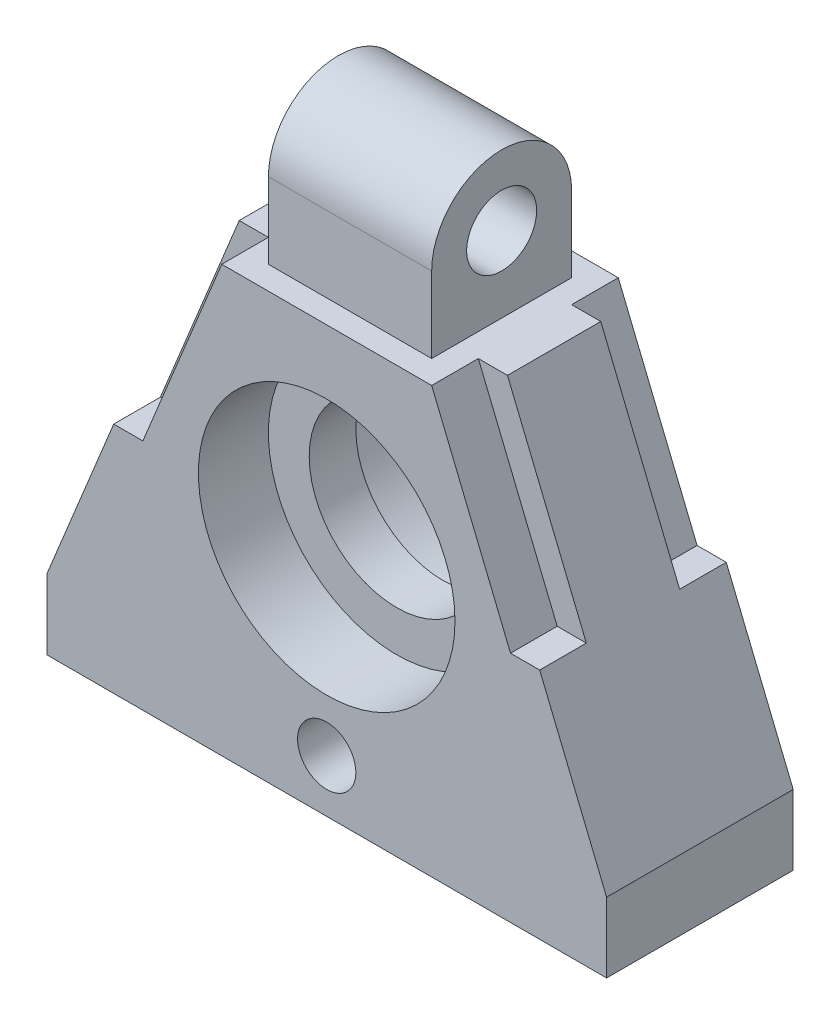
ISO-10303-21;
HEADER;
FILE_DESCRIPTION(('STEP AP214'),'2;1');
FILE_NAME('part.step','',(''),(''),'','','');
FILE_SCHEMA(('AUTOMOTIVE_DESIGN { 1 0 10303 214 1 1 1 1 }'));
ENDSEC;
DATA;
#1=APPLICATION_CONTEXT('core data for automotive mechanical design processes');
#2=APPLICATION_PROTOCOL_DEFINITION('international standard','automotive_design',2000,#1);
#3=PRODUCT_CONTEXT('',#1,'mechanical');
#4=PRODUCT('Part','Part','',(#3));
#5=PRODUCT_RELATED_PRODUCT_CATEGORY('part','',(#4));
#6=PRODUCT_DEFINITION_FORMATION('','',#4);
#7=PRODUCT_DEFINITION_CONTEXT('part definition',#1,'design');
#8=PRODUCT_DEFINITION('design','',#6,#7);
#9=PRODUCT_DEFINITION_SHAPE('','',#8);
#10=(LENGTH_UNIT() NAMED_UNIT(*) SI_UNIT(.MILLI.,.METRE.));
#11=(NAMED_UNIT(*) PLANE_ANGLE_UNIT() SI_UNIT($,.RADIAN.));
#12=(NAMED_UNIT(*) SI_UNIT($,.STERADIAN.) SOLID_ANGLE_UNIT());
#13=UNCERTAINTY_MEASURE_WITH_UNIT(LENGTH_MEASURE(1.E-05),#10,'distance_accuracy_value','');
#14=(GEOMETRIC_REPRESENTATION_CONTEXT(3) GLOBAL_UNCERTAINTY_ASSIGNED_CONTEXT((#13)) GLOBAL_UNIT_ASSIGNED_CONTEXT((#10,
#11,#12)) REPRESENTATION_CONTEXT('',''));
#15=CARTESIAN_POINT('',(0.,0.,0.));
#16=DIRECTION('',(0.,0.,1.));
#17=DIRECTION('',(1.,0.,0.));
#18=AXIS2_PLACEMENT_3D('',#15,#16,#17);
#19=CARTESIAN_POINT('',(-23.,73.,16.));
#20=DIRECTION('',(0.,-1.,0.));
#21=DIRECTION('',(0.,0.,-1.));
#22=AXIS2_PLACEMENT_3D('',#19,#20,#21);
#23=PLANE('',#22);
#24=DIRECTION('',(0.,0.,-1.));
#25=VECTOR('',#24,1.);
#26=CARTESIAN_POINT('',(-18.,73.,-8.));
#27=LINE('',#26,#25);
#28=CARTESIAN_POINT('',(-18.,73.,-8.));
#29=VERTEX_POINT('',#28);
#30=CARTESIAN_POINT('',(-18.,73.,-16.));
#31=VERTEX_POINT('',#30);
#32=EDGE_CURVE('E237',#29,#31,#27,.T.);
#33=ORIENTED_EDGE('',*,*,#32,.F.);
#34=DIRECTION('',(-1.,0.,0.));
#35=VECTOR('',#34,1.);
#36=CARTESIAN_POINT('',(-18.,73.,-8.));
#37=LINE('',#36,#35);
#38=CARTESIAN_POINT('',(-23.,73.,-8.));
#39=VERTEX_POINT('',#38);
#40=EDGE_CURVE('E229',#29,#39,#37,.T.);
#41=ORIENTED_EDGE('',*,*,#40,.T.);
#42=DIRECTION('',(0.,0.,-1.));
#43=VECTOR('',#42,1.);
#44=CARTESIAN_POINT('',(-23.,73.,16.));
#45=LINE('',#44,#43);
#46=CARTESIAN_POINT('',(-23.,73.,8.));
#47=VERTEX_POINT('',#46);
#48=EDGE_CURVE('E350',#47,#39,#45,.T.);
#49=ORIENTED_EDGE('',*,*,#48,.F.);
#50=DIRECTION('',(-1.,0.,0.));
#51=VECTOR('',#50,1.);
#52=CARTESIAN_POINT('',(-18.,73.,8.));
#53=LINE('',#52,#51);
#54=CARTESIAN_POINT('',(-18.,73.,8.));
#55=VERTEX_POINT('',#54);
#56=EDGE_CURVE('E278',#55,#47,#53,.T.);
#57=ORIENTED_EDGE('',*,*,#56,.F.);
#58=DIRECTION('',(0.,0.,1.));
#59=VECTOR('',#58,1.);
#60=CARTESIAN_POINT('',(-18.,73.,8.));
#61=LINE('',#60,#59);
#62=CARTESIAN_POINT('',(-18.,73.,16.));
#63=VERTEX_POINT('',#62);
#64=EDGE_CURVE('E286',#55,#63,#61,.T.);
#65=ORIENTED_EDGE('',*,*,#64,.T.);
#66=DIRECTION('',(-1.,0.,0.));
#67=VECTOR('',#66,1.);
#68=CARTESIAN_POINT('',(-23.,73.,16.));
#69=LINE('',#68,#67);
#70=CARTESIAN_POINT('',(18.,73.,16.));
#71=VERTEX_POINT('',#70);
#72=EDGE_CURVE('E347',#71,#63,#69,.T.);
#73=ORIENTED_EDGE('',*,*,#72,.F.);
#74=DIRECTION('',(0.,0.,1.));
#75=VECTOR('',#74,1.);
#76=CARTESIAN_POINT('',(18.,73.,8.));
#77=LINE('',#76,#75);
#78=CARTESIAN_POINT('',(18.,73.,8.));
#79=VERTEX_POINT('',#78);
#80=EDGE_CURVE('E309',#79,#71,#77,.T.);
#81=ORIENTED_EDGE('',*,*,#80,.F.);
#82=DIRECTION('',(-1.,0.,0.));
#83=VECTOR('',#82,1.);
#84=CARTESIAN_POINT('',(18.,73.,8.));
#85=LINE('',#84,#83);
#86=CARTESIAN_POINT('',(23.,73.,8.));
#87=VERTEX_POINT('',#86);
#88=EDGE_CURVE('E297',#87,#79,#85,.T.);
#89=ORIENTED_EDGE('',*,*,#88,.F.);
#90=DIRECTION('',(0.,0.,-1.));
#91=VECTOR('',#90,1.);
#92=CARTESIAN_POINT('',(23.,73.,16.));
#93=LINE('',#92,#91);
#94=CARTESIAN_POINT('',(23.,73.,-8.));
#95=VERTEX_POINT('',#94);
#96=EDGE_CURVE('E365',#87,#95,#93,.T.);
#97=ORIENTED_EDGE('',*,*,#96,.T.);
#98=DIRECTION('',(-1.,0.,0.));
#99=VECTOR('',#98,1.);
#100=CARTESIAN_POINT('',(18.,73.,-8.));
#101=LINE('',#100,#99);
#102=CARTESIAN_POINT('',(18.,73.,-8.));
#103=VERTEX_POINT('',#102);
#104=EDGE_CURVE('E244',#95,#103,#101,.T.);
#105=ORIENTED_EDGE('',*,*,#104,.T.);
#106=DIRECTION('',(0.,0.,-1.));
#107=VECTOR('',#106,1.);
#108=CARTESIAN_POINT('',(18.,73.,-8.));
#109=LINE('',#108,#107);
#110=CARTESIAN_POINT('',(18.,73.,-16.));
#111=VERTEX_POINT('',#110);
#112=EDGE_CURVE('E260',#103,#111,#109,.T.);
#113=ORIENTED_EDGE('',*,*,#112,.T.);
#114=DIRECTION('',(-1.,0.,0.));
#115=VECTOR('',#114,1.);
#116=CARTESIAN_POINT('',(-23.,73.,-16.));
#117=LINE('',#116,#115);
#118=EDGE_CURVE('E338',#111,#31,#117,.T.);
#119=ORIENTED_EDGE('',*,*,#118,.T.);
#120=EDGE_LOOP('',(#33,#41,#49,#57,#65,#73,#81,#89,#97,#105,#113,#119));
#121=FACE_BOUND('',#120,.T.);
#122=DIRECTION('',(-1.,0.,0.));
#123=VECTOR('',#122,1.);
#124=CARTESIAN_POINT('',(14.,73.,12.));
#125=LINE('',#124,#123);
#126=CARTESIAN_POINT('',(14.,73.,12.));
#127=VERTEX_POINT('',#126);
#128=CARTESIAN_POINT('',(-14.,73.,12.));
#129=VERTEX_POINT('',#128);
#130=EDGE_CURVE('E53',#127,#129,#125,.T.);
#131=ORIENTED_EDGE('',*,*,#130,.T.);
#132=DIRECTION('',(0.,0.,-1.));
#133=VECTOR('',#132,1.);
#134=CARTESIAN_POINT('',(-14.,73.,12.));
#135=LINE('',#134,#133);
#136=CARTESIAN_POINT('',(-14.,73.,-12.));
#137=VERTEX_POINT('',#136);
#138=EDGE_CURVE('E210',#129,#137,#135,.T.);
#139=ORIENTED_EDGE('',*,*,#138,.T.);
#140=DIRECTION('',(-1.,0.,0.));
#141=VECTOR('',#140,1.);
#142=CARTESIAN_POINT('',(14.,73.,-12.));
#143=LINE('',#142,#141);
#144=CARTESIAN_POINT('',(14.,73.,-12.));
#145=VERTEX_POINT('',#144);
#146=EDGE_CURVE('E197',#145,#137,#143,.T.);
#147=ORIENTED_EDGE('',*,*,#146,.F.);
#148=DIRECTION('',(0.,0.,-1.));
#149=VECTOR('',#148,1.);
#150=CARTESIAN_POINT('',(14.,73.,12.));
#151=LINE('',#150,#149);
#152=EDGE_CURVE('E48',#127,#145,#151,.T.);
#153=ORIENTED_EDGE('',*,*,#152,.F.);
#154=EDGE_LOOP('',(#131,#139,#147,#153));
#155=FACE_BOUND('',#154,.T.);
#156=ADVANCED_FACE('F33',(#121,#155),#23,.F.);
#157=CARTESIAN_POINT('',(0.,0.,-16.));
#158=DIRECTION('',(0.,0.,-1.));
#159=DIRECTION('',(-1.,0.,0.));
#160=AXIS2_PLACEMENT_3D('',#157,#158,#159);
#161=PLANE('',#160);
#162=CARTESIAN_POINT('',(0.,8.99999999999999,-16.));
#163=DIRECTION('',(0.,0.,1.));
#164=DIRECTION('',(1.,0.,0.));
#165=AXIS2_PLACEMENT_3D('',#162,#163,#164);
#166=CIRCLE('',#165,5.00000000000002);
#167=CARTESIAN_POINT('',(5.00000000000002,8.99999999999999,-16.));
#168=VERTEX_POINT('',#167);
#169=EDGE_CURVE('E326',#168,#168,#166,.T.);
#170=ORIENTED_EDGE('',*,*,#169,.T.);
#171=EDGE_LOOP('',(#170));
#172=FACE_BOUND('',#171,.T.);
#173=CARTESIAN_POINT('',(0.,40.,-16.));
#174=DIRECTION('',(0.,0.,1.));
#175=DIRECTION('',(1.,0.,0.));
#176=AXIS2_PLACEMENT_3D('',#173,#174,#175);
#177=CIRCLE('',#176,22.);
#178=CARTESIAN_POINT('',(22.,40.,-16.));
#179=VERTEX_POINT('',#178);
#180=EDGE_CURVE('E269',#179,#179,#177,.T.);
#181=ORIENTED_EDGE('',*,*,#180,.T.);
#182=EDGE_LOOP('',(#181));
#183=FACE_BOUND('',#182,.T.);
#184=DIRECTION('',(1.,0.,0.));
#185=VECTOR('',#184,1.);
#186=CARTESIAN_POINT('',(-36.5245901639344,40.,-16.));
#187=LINE('',#186,#185);
#188=CARTESIAN_POINT('',(-36.5245901639344,40.,-16.));
#189=VERTEX_POINT('',#188);
#190=CARTESIAN_POINT('',(-31.5245901639344,40.,-16.));
#191=VERTEX_POINT('',#190);
#192=EDGE_CURVE('E224',#189,#191,#187,.T.);
#193=ORIENTED_EDGE('',*,*,#192,.T.);
#194=DIRECTION('',(0.379223417483882,0.925305138660672,0.));
#195=VECTOR('',#194,1.);
#196=CARTESIAN_POINT('',(-31.5245901639344,40.,-16.));
#197=LINE('',#196,#195);
#198=EDGE_CURVE('E219',#191,#31,#197,.T.);
#199=ORIENTED_EDGE('',*,*,#198,.T.);
#200=ORIENTED_EDGE('',*,*,#118,.F.);
#201=DIRECTION('',(0.379223417483882,-0.925305138660672,0.));
#202=VECTOR('',#201,1.);
#203=CARTESIAN_POINT('',(31.5245901639344,40.,-16.));
#204=LINE('',#203,#202);
#205=CARTESIAN_POINT('',(31.5245901639344,40.,-16.));
#206=VERTEX_POINT('',#205);
#207=EDGE_CURVE('E248',#111,#206,#204,.T.);
#208=ORIENTED_EDGE('',*,*,#207,.T.);
#209=DIRECTION('',(1.,0.,0.));
#210=VECTOR('',#209,1.);
#211=CARTESIAN_POINT('',(36.5245901639344,40.,-16.));
#212=LINE('',#211,#210);
#213=CARTESIAN_POINT('',(36.5245901639344,40.,-16.));
#214=VERTEX_POINT('',#213);
#215=EDGE_CURVE('E239',#206,#214,#212,.T.);
#216=ORIENTED_EDGE('',*,*,#215,.T.);
#217=DIRECTION('',(-0.379223417483882,0.925305138660672,0.));
#218=VECTOR('',#217,1.);
#219=CARTESIAN_POINT('',(23.,73.,-16.));
#220=LINE('',#219,#218);
#221=CARTESIAN_POINT('',(48.,12.,-16.));
#222=VERTEX_POINT('',#221);
#223=EDGE_CURVE('E358',#222,#214,#220,.T.);
#224=ORIENTED_EDGE('',*,*,#223,.F.);
#225=DIRECTION('',(0.,1.,0.));
#226=VECTOR('',#225,1.);
#227=CARTESIAN_POINT('',(48.,12.,-16.));
#228=LINE('',#227,#226);
#229=CARTESIAN_POINT('',(48.,0.,-16.));
#230=VERTEX_POINT('',#229);
#231=EDGE_CURVE('E356',#230,#222,#228,.T.);
#232=ORIENTED_EDGE('',*,*,#231,.F.);
#233=DIRECTION('',(1.,0.,0.));
#234=VECTOR('',#233,1.);
#235=CARTESIAN_POINT('',(48.,0.,-16.));
#236=LINE('',#235,#234);
#237=CARTESIAN_POINT('',(-48.,0.,-16.));
#238=VERTEX_POINT('',#237);
#239=EDGE_CURVE('E354',#238,#230,#236,.T.);
#240=ORIENTED_EDGE('',*,*,#239,.F.);
#241=DIRECTION('',(0.,-1.,0.));
#242=VECTOR('',#241,1.);
#243=CARTESIAN_POINT('',(-48.,0.,-16.));
#244=LINE('',#243,#242);
#245=CARTESIAN_POINT('',(-48.,12.,-16.));
#246=VERTEX_POINT('',#245);
#247=EDGE_CURVE('E352',#246,#238,#244,.T.);
#248=ORIENTED_EDGE('',*,*,#247,.F.);
#249=DIRECTION('',(-0.379223417483882,-0.925305138660672,0.));
#250=VECTOR('',#249,1.);
#251=CARTESIAN_POINT('',(-48.,12.,-16.));
#252=LINE('',#251,#250);
#253=EDGE_CURVE('E332',#189,#246,#252,.T.);
#254=ORIENTED_EDGE('',*,*,#253,.F.);
#255=EDGE_LOOP('',(#193,#199,#200,#208,#216,#224,#232,#240,#248,#254));
#256=FACE_BOUND('',#255,.T.);
#257=ADVANCED_FACE('F385',(#172,#183,#256),#161,.T.);
#258=CARTESIAN_POINT('',(-48.,12.,16.));
#259=DIRECTION('',(0.925305138660672,-0.379223417483882,0.));
#260=DIRECTION('',(0.379223417483882,0.925305138660672,0.));
#261=AXIS2_PLACEMENT_3D('',#258,#259,#260);
#262=PLANE('',#261);
#263=DIRECTION('',(0.,0.,-1.));
#264=VECTOR('',#263,1.);
#265=CARTESIAN_POINT('',(-36.5245901639344,40.,-8.));
#266=LINE('',#265,#264);
#267=CARTESIAN_POINT('',(-36.5245901639344,40.,-8.));
#268=VERTEX_POINT('',#267);
#269=EDGE_CURVE('E240',#268,#189,#266,.T.);
#270=ORIENTED_EDGE('',*,*,#269,.T.);
#271=ORIENTED_EDGE('',*,*,#253,.T.);
#272=DIRECTION('',(0.,0.,-1.));
#273=VECTOR('',#272,1.);
#274=CARTESIAN_POINT('',(-48.,12.,16.));
#275=LINE('',#274,#273);
#276=CARTESIAN_POINT('',(-48.,12.,16.));
#277=VERTEX_POINT('',#276);
#278=EDGE_CURVE('E11',#277,#246,#275,.T.);
#279=ORIENTED_EDGE('',*,*,#278,.F.);
#280=DIRECTION('',(-0.379223417483882,-0.925305138660672,0.));
#281=VECTOR('',#280,1.);
#282=CARTESIAN_POINT('',(-48.,12.,16.));
#283=LINE('',#282,#281);
#284=CARTESIAN_POINT('',(-36.5245901639344,40.,16.));
#285=VERTEX_POINT('',#284);
#286=EDGE_CURVE('E335',#285,#277,#283,.T.);
#287=ORIENTED_EDGE('',*,*,#286,.F.);
#288=DIRECTION('',(0.,0.,1.));
#289=VECTOR('',#288,1.);
#290=CARTESIAN_POINT('',(-36.5245901639344,40.,8.));
#291=LINE('',#290,#289);
#292=CARTESIAN_POINT('',(-36.5245901639344,40.,8.));
#293=VERTEX_POINT('',#292);
#294=EDGE_CURVE('E293',#293,#285,#291,.T.);
#295=ORIENTED_EDGE('',*,*,#294,.F.);
#296=DIRECTION('',(-0.379223417483882,-0.925305138660672,0.));
#297=VECTOR('',#296,1.);
#298=CARTESIAN_POINT('',(-23.,73.,8.));
#299=LINE('',#298,#297);
#300=EDGE_CURVE('E281',#47,#293,#299,.T.);
#301=ORIENTED_EDGE('',*,*,#300,.F.);
#302=ORIENTED_EDGE('',*,*,#48,.T.);
#303=DIRECTION('',(-0.379223417483882,-0.925305138660672,0.));
#304=VECTOR('',#303,1.);
#305=CARTESIAN_POINT('',(-23.,73.,-8.));
#306=LINE('',#305,#304);
#307=EDGE_CURVE('E226',#39,#268,#306,.T.);
#308=ORIENTED_EDGE('',*,*,#307,.T.);
#309=EDGE_LOOP('',(#270,#271,#279,#287,#295,#301,#302,#308));
#310=FACE_BOUND('',#309,.T.);
#311=ADVANCED_FACE('F35',(#310),#262,.F.);
#312=CARTESIAN_POINT('',(23.,73.,16.));
#313=DIRECTION('',(-0.925305138660672,-0.379223417483882,0.));
#314=DIRECTION('',(0.379223417483882,-0.925305138660672,0.));
#315=AXIS2_PLACEMENT_3D('',#312,#313,#314);
#316=PLANE('',#315);
#317=DIRECTION('',(0.,0.,-1.));
#318=VECTOR('',#317,1.);
#319=CARTESIAN_POINT('',(36.5245901639344,40.,-8.));
#320=LINE('',#319,#318);
#321=CARTESIAN_POINT('',(36.5245901639344,40.,-8.));
#322=VERTEX_POINT('',#321);
#323=EDGE_CURVE('E255',#322,#214,#320,.T.);
#324=ORIENTED_EDGE('',*,*,#323,.F.);
#325=DIRECTION('',(-0.379223417483882,0.925305138660672,0.));
#326=VECTOR('',#325,1.);
#327=CARTESIAN_POINT('',(23.,73.,-8.));
#328=LINE('',#327,#326);
#329=EDGE_CURVE('E247',#322,#95,#328,.T.);
#330=ORIENTED_EDGE('',*,*,#329,.T.);
#331=ORIENTED_EDGE('',*,*,#96,.F.);
#332=DIRECTION('',(-0.379223417483882,0.925305138660672,0.));
#333=VECTOR('',#332,1.);
#334=CARTESIAN_POINT('',(23.,73.,8.));
#335=LINE('',#334,#333);
#336=CARTESIAN_POINT('',(36.5245901639344,40.,8.));
#337=VERTEX_POINT('',#336);
#338=EDGE_CURVE('E307',#337,#87,#335,.T.);
#339=ORIENTED_EDGE('',*,*,#338,.F.);
#340=DIRECTION('',(0.,0.,1.));
#341=VECTOR('',#340,1.);
#342=CARTESIAN_POINT('',(36.5245901639344,40.,8.));
#343=LINE('',#342,#341);
#344=CARTESIAN_POINT('',(36.5245901639344,40.,16.));
#345=VERTEX_POINT('',#344);
#346=EDGE_CURVE('E313',#337,#345,#343,.T.);
#347=ORIENTED_EDGE('',*,*,#346,.T.);
#348=DIRECTION('',(-0.379223417483882,0.925305138660672,0.));
#349=VECTOR('',#348,1.);
#350=CARTESIAN_POINT('',(23.,73.,16.));
#351=LINE('',#350,#349);
#352=CARTESIAN_POINT('',(48.,12.,16.));
#353=VERTEX_POINT('',#352);
#354=EDGE_CURVE('E344',#353,#345,#351,.T.);
#355=ORIENTED_EDGE('',*,*,#354,.F.);
#356=DIRECTION('',(0.,0.,-1.));
#357=VECTOR('',#356,1.);
#358=CARTESIAN_POINT('',(48.,12.,16.));
#359=LINE('',#358,#357);
#360=EDGE_CURVE('E368',#353,#222,#359,.T.);
#361=ORIENTED_EDGE('',*,*,#360,.T.);
#362=ORIENTED_EDGE('',*,*,#223,.T.);
#363=EDGE_LOOP('',(#324,#330,#331,#339,#347,#355,#361,#362));
#364=FACE_BOUND('',#363,.T.);
#365=ADVANCED_FACE('F395',(#364),#316,.F.);
#366=CARTESIAN_POINT('',(0.,40.,16.));
#367=DIRECTION('',(0.,0.,-1.));
#368=DIRECTION('',(-1.,0.,0.));
#369=AXIS2_PLACEMENT_3D('',#366,#367,#368);
#370=CYLINDRICAL_SURFACE('',#369,15.);
#371=CARTESIAN_POINT('',(0.,40.,4.));
#372=DIRECTION('',(0.,0.,1.));
#373=DIRECTION('',(1.,0.,0.));
#374=AXIS2_PLACEMENT_3D('',#371,#372,#373);
#375=CIRCLE('',#374,15.);
#376=CARTESIAN_POINT('',(15.,40.,4.));
#377=VERTEX_POINT('',#376);
#378=EDGE_CURVE('E316',#377,#377,#375,.T.);
#379=ORIENTED_EDGE('',*,*,#378,.T.);
#380=EDGE_LOOP('',(#379));
#381=FACE_BOUND('',#380,.T.);
#382=CARTESIAN_POINT('',(0.,40.,-4.));
#383=DIRECTION('',(0.,0.,1.));
#384=DIRECTION('',(1.,0.,0.));
#385=AXIS2_PLACEMENT_3D('',#382,#383,#384);
#386=CIRCLE('',#385,15.);
#387=CARTESIAN_POINT('',(15.,40.,-4.));
#388=VERTEX_POINT('',#387);
#389=EDGE_CURVE('E263',#388,#388,#386,.T.);
#390=ORIENTED_EDGE('',*,*,#389,.F.);
#391=EDGE_LOOP('',(#390));
#392=FACE_BOUND('',#391,.T.);
#393=ADVANCED_FACE('F476',(#381,#392),#370,.F.);
#394=CARTESIAN_POINT('',(0.,0.,16.));
#395=DIRECTION('',(0.,0.,-1.));
#396=DIRECTION('',(-1.,0.,0.));
#397=AXIS2_PLACEMENT_3D('',#394,#395,#396);
#398=PLANE('',#397);
#399=CARTESIAN_POINT('',(0.,40.,16.));
#400=DIRECTION('',(0.,0.,1.));
#401=DIRECTION('',(1.,0.,0.));
#402=AXIS2_PLACEMENT_3D('',#399,#400,#401);
#403=CIRCLE('',#402,22.);
#404=CARTESIAN_POINT('',(22.,40.,16.));
#405=VERTEX_POINT('',#404);
#406=EDGE_CURVE('E322',#405,#405,#403,.T.);
#407=ORIENTED_EDGE('',*,*,#406,.F.);
#408=EDGE_LOOP('',(#407));
#409=FACE_BOUND('',#408,.T.);
#410=ORIENTED_EDGE('',*,*,#72,.T.);
#411=DIRECTION('',(0.379223417483882,0.925305138660672,0.));
#412=VECTOR('',#411,1.);
#413=CARTESIAN_POINT('',(-31.5245901639344,40.,16.));
#414=LINE('',#413,#412);
#415=CARTESIAN_POINT('',(-31.5245901639344,40.,16.));
#416=VERTEX_POINT('',#415);
#417=EDGE_CURVE('E273',#416,#63,#414,.T.);
#418=ORIENTED_EDGE('',*,*,#417,.F.);
#419=DIRECTION('',(1.,0.,0.));
#420=VECTOR('',#419,1.);
#421=CARTESIAN_POINT('',(-36.5245901639344,40.,16.));
#422=LINE('',#421,#420);
#423=EDGE_CURVE('E279',#285,#416,#422,.T.);
#424=ORIENTED_EDGE('',*,*,#423,.F.);
#425=ORIENTED_EDGE('',*,*,#286,.T.);
#426=DIRECTION('',(0.,-1.,0.));
#427=VECTOR('',#426,1.);
#428=CARTESIAN_POINT('',(-48.,0.,16.));
#429=LINE('',#428,#427);
#430=CARTESIAN_POINT('',(-48.,0.,16.));
#431=VERTEX_POINT('',#430);
#432=EDGE_CURVE('E337',#277,#431,#429,.T.);
#433=ORIENTED_EDGE('',*,*,#432,.T.);
#434=DIRECTION('',(1.,0.,0.));
#435=VECTOR('',#434,1.);
#436=CARTESIAN_POINT('',(48.,0.,16.));
#437=LINE('',#436,#435);
#438=CARTESIAN_POINT('',(48.,0.,16.));
#439=VERTEX_POINT('',#438);
#440=EDGE_CURVE('E340',#431,#439,#437,.T.);
#441=ORIENTED_EDGE('',*,*,#440,.T.);
#442=DIRECTION('',(0.,1.,0.));
#443=VECTOR('',#442,1.);
#444=CARTESIAN_POINT('',(48.,12.,16.));
#445=LINE('',#444,#443);
#446=EDGE_CURVE('E342',#439,#353,#445,.T.);
#447=ORIENTED_EDGE('',*,*,#446,.T.);
#448=ORIENTED_EDGE('',*,*,#354,.T.);
#449=DIRECTION('',(1.,0.,0.));
#450=VECTOR('',#449,1.);
#451=CARTESIAN_POINT('',(36.5245901639344,40.,16.));
#452=LINE('',#451,#450);
#453=CARTESIAN_POINT('',(31.5245901639344,40.,16.));
#454=VERTEX_POINT('',#453);
#455=EDGE_CURVE('E301',#454,#345,#452,.T.);
#456=ORIENTED_EDGE('',*,*,#455,.F.);
#457=DIRECTION('',(0.379223417483882,-0.925305138660672,0.));
#458=VECTOR('',#457,1.);
#459=CARTESIAN_POINT('',(31.5245901639344,40.,16.));
#460=LINE('',#459,#458);
#461=EDGE_CURVE('E292',#71,#454,#460,.T.);
#462=ORIENTED_EDGE('',*,*,#461,.F.);
#463=EDGE_LOOP('',(#410,#418,#424,#425,#433,#441,#447,#448,#456,#462));
#464=FACE_BOUND('',#463,.T.);
#465=CARTESIAN_POINT('',(0.,8.99999999999999,16.));
#466=DIRECTION('',(0.,0.,1.));
#467=DIRECTION('',(1.,0.,0.));
#468=AXIS2_PLACEMENT_3D('',#465,#466,#467);
#469=CIRCLE('',#468,5.00000000000002);
#470=CARTESIAN_POINT('',(5.00000000000002,8.99999999999999,16.));
#471=VERTEX_POINT('',#470);
#472=EDGE_CURVE('E329',#471,#471,#469,.T.);
#473=ORIENTED_EDGE('',*,*,#472,.F.);
#474=EDGE_LOOP('',(#473));
#475=FACE_BOUND('',#474,.T.);
#476=ADVANCED_FACE('F399',(#409,#464,#475),#398,.F.);
#477=CARTESIAN_POINT('',(-48.,0.,16.));
#478=DIRECTION('',(1.,0.,0.));
#479=DIRECTION('',(0.,0.,-1.));
#480=AXIS2_PLACEMENT_3D('',#477,#478,#479);
#481=PLANE('',#480);
#482=ORIENTED_EDGE('',*,*,#247,.T.);
#483=DIRECTION('',(0.,0.,-1.));
#484=VECTOR('',#483,1.);
#485=CARTESIAN_POINT('',(-48.,0.,16.));
#486=LINE('',#485,#484);
#487=EDGE_CURVE('E41',#431,#238,#486,.T.);
#488=ORIENTED_EDGE('',*,*,#487,.F.);
#489=ORIENTED_EDGE('',*,*,#432,.F.);
#490=ORIENTED_EDGE('',*,*,#278,.T.);
#491=EDGE_LOOP('',(#482,#488,#489,#490));
#492=FACE_BOUND('',#491,.T.);
#493=ADVANCED_FACE('F405',(#492),#481,.F.);
#494=CARTESIAN_POINT('',(48.,0.,16.));
#495=DIRECTION('',(0.,1.,0.));
#496=DIRECTION('',(0.,0.,1.));
#497=AXIS2_PLACEMENT_3D('',#494,#495,#496);
#498=PLANE('',#497);
#499=ORIENTED_EDGE('',*,*,#239,.T.);
#500=DIRECTION('',(0.,0.,-1.));
#501=VECTOR('',#500,1.);
#502=CARTESIAN_POINT('',(48.,0.,16.));
#503=LINE('',#502,#501);
#504=EDGE_CURVE('E371',#439,#230,#503,.T.);
#505=ORIENTED_EDGE('',*,*,#504,.F.);
#506=ORIENTED_EDGE('',*,*,#440,.F.);
#507=ORIENTED_EDGE('',*,*,#487,.T.);
#508=EDGE_LOOP('',(#499,#505,#506,#507));
#509=FACE_BOUND('',#508,.T.);
#510=ADVANCED_FACE('F378',(#509),#498,.F.);
#511=CARTESIAN_POINT('',(48.,12.,16.));
#512=DIRECTION('',(-1.,0.,0.));
#513=DIRECTION('',(0.,0.,1.));
#514=AXIS2_PLACEMENT_3D('',#511,#512,#513);
#515=PLANE('',#514);
#516=ORIENTED_EDGE('',*,*,#231,.T.);
#517=ORIENTED_EDGE('',*,*,#360,.F.);
#518=ORIENTED_EDGE('',*,*,#446,.F.);
#519=ORIENTED_EDGE('',*,*,#504,.T.);
#520=EDGE_LOOP('',(#516,#517,#518,#519));
#521=FACE_BOUND('',#520,.T.);
#522=ADVANCED_FACE('F390',(#521),#515,.F.);
#523=CARTESIAN_POINT('',(0.,8.99999999999999,16.));
#524=DIRECTION('',(0.,0.,-1.));
#525=DIRECTION('',(-1.,0.,0.));
#526=AXIS2_PLACEMENT_3D('',#523,#524,#525);
#527=CYLINDRICAL_SURFACE('',#526,5.00000000000002);
#528=ORIENTED_EDGE('',*,*,#472,.T.);
#529=EDGE_LOOP('',(#528));
#530=FACE_BOUND('',#529,.T.);
#531=ORIENTED_EDGE('',*,*,#169,.F.);
#532=EDGE_LOOP('',(#531));
#533=FACE_BOUND('',#532,.T.);
#534=ADVANCED_FACE('F479',(#530,#533),#527,.F.);
#535=CARTESIAN_POINT('',(0.,40.,4.));
#536=DIRECTION('',(0.,0.,1.));
#537=DIRECTION('',(1.,0.,0.));
#538=AXIS2_PLACEMENT_3D('',#535,#536,#537);
#539=CYLINDRICAL_SURFACE('',#538,22.);
#540=CARTESIAN_POINT('',(0.,40.,4.));
#541=DIRECTION('',(0.,0.,1.));
#542=DIRECTION('',(1.,0.,0.));
#543=AXIS2_PLACEMENT_3D('',#540,#541,#542);
#544=CIRCLE('',#543,22.);
#545=CARTESIAN_POINT('',(22.,40.,4.));
#546=VERTEX_POINT('',#545);
#547=EDGE_CURVE('E323',#546,#546,#544,.T.);
#548=ORIENTED_EDGE('',*,*,#547,.F.);
#549=EDGE_LOOP('',(#548));
#550=FACE_BOUND('',#549,.T.);
#551=ORIENTED_EDGE('',*,*,#406,.T.);
#552=EDGE_LOOP('',(#551));
#553=FACE_BOUND('',#552,.T.);
#554=ADVANCED_FACE('F495',(#550,#553),#539,.F.);
#555=CARTESIAN_POINT('',(0.,40.,4.));
#556=DIRECTION('',(0.,0.,1.));
#557=DIRECTION('',(1.,0.,0.));
#558=AXIS2_PLACEMENT_3D('',#555,#556,#557);
#559=PLANE('',#558);
#560=ORIENTED_EDGE('',*,*,#378,.F.);
#561=EDGE_LOOP('',(#560));
#562=FACE_BOUND('',#561,.T.);
#563=ORIENTED_EDGE('',*,*,#547,.T.);
#564=EDGE_LOOP('',(#563));
#565=FACE_BOUND('',#564,.T.);
#566=ADVANCED_FACE('F499',(#562,#565),#559,.T.);
#567=CARTESIAN_POINT('',(36.5245901639344,40.,8.));
#568=DIRECTION('',(0.,-1.,0.));
#569=DIRECTION('',(0.,0.,-1.));
#570=AXIS2_PLACEMENT_3D('',#567,#568,#569);
#571=PLANE('',#570);
#572=ORIENTED_EDGE('',*,*,#455,.T.);
#573=ORIENTED_EDGE('',*,*,#346,.F.);
#574=DIRECTION('',(1.,0.,0.));
#575=VECTOR('',#574,1.);
#576=CARTESIAN_POINT('',(36.5245901639344,40.,8.));
#577=LINE('',#576,#575);
#578=CARTESIAN_POINT('',(31.5245901639344,40.,8.));
#579=VERTEX_POINT('',#578);
#580=EDGE_CURVE('E304',#579,#337,#577,.T.);
#581=ORIENTED_EDGE('',*,*,#580,.F.);
#582=DIRECTION('',(0.,0.,1.));
#583=VECTOR('',#582,1.);
#584=CARTESIAN_POINT('',(31.5245901639344,40.,8.));
#585=LINE('',#584,#583);
#586=EDGE_CURVE('E317',#579,#454,#585,.T.);
#587=ORIENTED_EDGE('',*,*,#586,.T.);
#588=EDGE_LOOP('',(#572,#573,#581,#587));
#589=FACE_BOUND('',#588,.T.);
#590=ADVANCED_FACE('F438',(#589),#571,.F.);
#591=CARTESIAN_POINT('',(31.5245901639344,40.,8.));
#592=DIRECTION('',(-0.925305138660672,-0.379223417483882,0.));
#593=DIRECTION('',(0.379223417483882,-0.925305138660672,0.));
#594=AXIS2_PLACEMENT_3D('',#591,#592,#593);
#595=PLANE('',#594);
#596=ORIENTED_EDGE('',*,*,#461,.T.);
#597=ORIENTED_EDGE('',*,*,#586,.F.);
#598=DIRECTION('',(0.379223417483882,-0.925305138660672,0.));
#599=VECTOR('',#598,1.);
#600=CARTESIAN_POINT('',(31.5245901639344,40.,8.));
#601=LINE('',#600,#599);
#602=EDGE_CURVE('E300',#79,#579,#601,.T.);
#603=ORIENTED_EDGE('',*,*,#602,.F.);
#604=ORIENTED_EDGE('',*,*,#80,.T.);
#605=EDGE_LOOP('',(#596,#597,#603,#604));
#606=FACE_BOUND('',#605,.T.);
#607=ADVANCED_FACE('F440',(#606),#595,.F.);
#608=CARTESIAN_POINT('',(0.,0.,8.));
#609=DIRECTION('',(0.,0.,-1.));
#610=DIRECTION('',(-1.,0.,0.));
#611=AXIS2_PLACEMENT_3D('',#608,#609,#610);
#612=PLANE('',#611);
#613=ORIENTED_EDGE('',*,*,#88,.T.);
#614=ORIENTED_EDGE('',*,*,#602,.T.);
#615=ORIENTED_EDGE('',*,*,#580,.T.);
#616=ORIENTED_EDGE('',*,*,#338,.T.);
#617=EDGE_LOOP('',(#613,#614,#615,#616));
#618=FACE_BOUND('',#617,.T.);
#619=ADVANCED_FACE('F435',(#618),#612,.F.);
#620=CARTESIAN_POINT('',(-31.5245901639344,40.,8.));
#621=DIRECTION('',(0.925305138660672,-0.379223417483882,0.));
#622=DIRECTION('',(0.379223417483882,0.925305138660672,0.));
#623=AXIS2_PLACEMENT_3D('',#620,#621,#622);
#624=PLANE('',#623);
#625=ORIENTED_EDGE('',*,*,#417,.T.);
#626=ORIENTED_EDGE('',*,*,#64,.F.);
#627=DIRECTION('',(0.379223417483882,0.925305138660672,0.));
#628=VECTOR('',#627,1.);
#629=CARTESIAN_POINT('',(-31.5245901639344,40.,8.));
#630=LINE('',#629,#628);
#631=CARTESIAN_POINT('',(-31.5245901639344,40.,8.));
#632=VERTEX_POINT('',#631);
#633=EDGE_CURVE('E276',#632,#55,#630,.T.);
#634=ORIENTED_EDGE('',*,*,#633,.F.);
#635=DIRECTION('',(0.,0.,1.));
#636=VECTOR('',#635,1.);
#637=CARTESIAN_POINT('',(-31.5245901639344,40.,8.));
#638=LINE('',#637,#636);
#639=EDGE_CURVE('E290',#632,#416,#638,.T.);
#640=ORIENTED_EDGE('',*,*,#639,.T.);
#641=EDGE_LOOP('',(#625,#626,#634,#640));
#642=FACE_BOUND('',#641,.T.);
#643=ADVANCED_FACE('F446',(#642),#624,.F.);
#644=CARTESIAN_POINT('',(-36.5245901639344,40.,8.));
#645=DIRECTION('',(0.,-1.,0.));
#646=DIRECTION('',(0.,0.,-1.));
#647=AXIS2_PLACEMENT_3D('',#644,#645,#646);
#648=PLANE('',#647);
#649=ORIENTED_EDGE('',*,*,#423,.T.);
#650=ORIENTED_EDGE('',*,*,#639,.F.);
#651=DIRECTION('',(1.,0.,0.));
#652=VECTOR('',#651,1.);
#653=CARTESIAN_POINT('',(-36.5245901639344,40.,8.));
#654=LINE('',#653,#652);
#655=EDGE_CURVE('E283',#293,#632,#654,.T.);
#656=ORIENTED_EDGE('',*,*,#655,.F.);
#657=ORIENTED_EDGE('',*,*,#294,.T.);
#658=EDGE_LOOP('',(#649,#650,#656,#657));
#659=FACE_BOUND('',#658,.T.);
#660=ADVANCED_FACE('F448',(#659),#648,.F.);
#661=CARTESIAN_POINT('',(0.,0.,8.));
#662=DIRECTION('',(0.,0.,1.));
#663=DIRECTION('',(1.,0.,0.));
#664=AXIS2_PLACEMENT_3D('',#661,#662,#663);
#665=PLANE('',#664);
#666=ORIENTED_EDGE('',*,*,#633,.T.);
#667=ORIENTED_EDGE('',*,*,#56,.T.);
#668=ORIENTED_EDGE('',*,*,#300,.T.);
#669=ORIENTED_EDGE('',*,*,#655,.T.);
#670=EDGE_LOOP('',(#666,#667,#668,#669));
#671=FACE_BOUND('',#670,.T.);
#672=ADVANCED_FACE('F452',(#671),#665,.T.);
#673=CARTESIAN_POINT('',(0.,40.,-4.));
#674=DIRECTION('',(0.,0.,-1.));
#675=DIRECTION('',(1.,0.,0.));
#676=AXIS2_PLACEMENT_3D('',#673,#674,#675);
#677=PLANE('',#676);
#678=CARTESIAN_POINT('',(0.,40.,-4.));
#679=DIRECTION('',(0.,0.,1.));
#680=DIRECTION('',(1.,0.,0.));
#681=AXIS2_PLACEMENT_3D('',#678,#679,#680);
#682=CIRCLE('',#681,22.);
#683=CARTESIAN_POINT('',(22.,40.,-4.));
#684=VERTEX_POINT('',#683);
#685=EDGE_CURVE('E270',#684,#684,#682,.T.);
#686=ORIENTED_EDGE('',*,*,#685,.F.);
#687=EDGE_LOOP('',(#686));
#688=FACE_BOUND('',#687,.T.);
#689=ORIENTED_EDGE('',*,*,#389,.T.);
#690=EDGE_LOOP('',(#689));
#691=FACE_BOUND('',#690,.T.);
#692=ADVANCED_FACE('F454',(#688,#691),#677,.T.);
#693=CARTESIAN_POINT('',(0.,40.,-4.));
#694=DIRECTION('',(0.,0.,-1.));
#695=DIRECTION('',(-1.,0.,0.));
#696=AXIS2_PLACEMENT_3D('',#693,#694,#695);
#697=CYLINDRICAL_SURFACE('',#696,22.);
#698=ORIENTED_EDGE('',*,*,#685,.T.);
#699=EDGE_LOOP('',(#698));
#700=FACE_BOUND('',#699,.T.);
#701=ORIENTED_EDGE('',*,*,#180,.F.);
#702=EDGE_LOOP('',(#701));
#703=FACE_BOUND('',#702,.T.);
#704=ADVANCED_FACE('F460',(#700,#703),#697,.F.);
#705=CARTESIAN_POINT('',(31.5245901639344,40.,-8.));
#706=DIRECTION('',(0.925305138660672,0.379223417483882,0.));
#707=DIRECTION('',(-0.379223417483882,0.925305138660672,0.));
#708=AXIS2_PLACEMENT_3D('',#705,#706,#707);
#709=PLANE('',#708);
#710=ORIENTED_EDGE('',*,*,#207,.F.);
#711=ORIENTED_EDGE('',*,*,#112,.F.);
#712=DIRECTION('',(0.379223417483882,-0.925305138660672,0.));
#713=VECTOR('',#712,1.);
#714=CARTESIAN_POINT('',(31.5245901639344,40.,-8.));
#715=LINE('',#714,#713);
#716=CARTESIAN_POINT('',(31.5245901639344,40.,-8.));
#717=VERTEX_POINT('',#716);
#718=EDGE_CURVE('E253',#103,#717,#715,.T.);
#719=ORIENTED_EDGE('',*,*,#718,.T.);
#720=DIRECTION('',(0.,0.,-1.));
#721=VECTOR('',#720,1.);
#722=CARTESIAN_POINT('',(31.5245901639344,40.,-8.));
#723=LINE('',#722,#721);
#724=EDGE_CURVE('E264',#717,#206,#723,.T.);
#725=ORIENTED_EDGE('',*,*,#724,.T.);
#726=EDGE_LOOP('',(#710,#711,#719,#725));
#727=FACE_BOUND('',#726,.T.);
#728=ADVANCED_FACE('F422',(#727),#709,.T.);
#729=CARTESIAN_POINT('',(36.5245901639344,40.,-8.));
#730=DIRECTION('',(0.,1.,0.));
#731=DIRECTION('',(0.,0.,1.));
#732=AXIS2_PLACEMENT_3D('',#729,#730,#731);
#733=PLANE('',#732);
#734=ORIENTED_EDGE('',*,*,#215,.F.);
#735=ORIENTED_EDGE('',*,*,#724,.F.);
#736=DIRECTION('',(1.,0.,0.));
#737=VECTOR('',#736,1.);
#738=CARTESIAN_POINT('',(36.5245901639344,40.,-8.));
#739=LINE('',#738,#737);
#740=EDGE_CURVE('E251',#717,#322,#739,.T.);
#741=ORIENTED_EDGE('',*,*,#740,.T.);
#742=ORIENTED_EDGE('',*,*,#323,.T.);
#743=EDGE_LOOP('',(#734,#735,#741,#742));
#744=FACE_BOUND('',#743,.T.);
#745=ADVANCED_FACE('F427',(#744),#733,.T.);
#746=CARTESIAN_POINT('',(0.,0.,-8.));
#747=DIRECTION('',(0.,0.,1.));
#748=DIRECTION('',(-1.,0.,0.));
#749=AXIS2_PLACEMENT_3D('',#746,#747,#748);
#750=PLANE('',#749);
#751=ORIENTED_EDGE('',*,*,#104,.F.);
#752=ORIENTED_EDGE('',*,*,#329,.F.);
#753=ORIENTED_EDGE('',*,*,#740,.F.);
#754=ORIENTED_EDGE('',*,*,#718,.F.);
#755=EDGE_LOOP('',(#751,#752,#753,#754));
#756=FACE_BOUND('',#755,.T.);
#757=ADVANCED_FACE('F579',(#756),#750,.F.);
#758=CARTESIAN_POINT('',(-31.5245901639344,40.,-8.));
#759=DIRECTION('',(-0.925305138660672,0.379223417483882,0.));
#760=DIRECTION('',(-0.379223417483882,-0.925305138660672,0.));
#761=AXIS2_PLACEMENT_3D('',#758,#759,#760);
#762=PLANE('',#761);
#763=ORIENTED_EDGE('',*,*,#198,.F.);
#764=DIRECTION('',(0.,0.,-1.));
#765=VECTOR('',#764,1.);
#766=CARTESIAN_POINT('',(-31.5245901639344,40.,-8.));
#767=LINE('',#766,#765);
#768=CARTESIAN_POINT('',(-31.5245901639344,40.,-8.));
#769=VERTEX_POINT('',#768);
#770=EDGE_CURVE('E232',#769,#191,#767,.T.);
#771=ORIENTED_EDGE('',*,*,#770,.F.);
#772=DIRECTION('',(0.379223417483882,0.925305138660672,0.));
#773=VECTOR('',#772,1.);
#774=CARTESIAN_POINT('',(-31.5245901639344,40.,-8.));
#775=LINE('',#774,#773);
#776=EDGE_CURVE('E220',#769,#29,#775,.T.);
#777=ORIENTED_EDGE('',*,*,#776,.T.);
#778=ORIENTED_EDGE('',*,*,#32,.T.);
#779=EDGE_LOOP('',(#763,#771,#777,#778));
#780=FACE_BOUND('',#779,.T.);
#781=ADVANCED_FACE('F416',(#780),#762,.T.);
#782=CARTESIAN_POINT('',(-36.5245901639344,40.,-8.));
#783=DIRECTION('',(0.,1.,0.));
#784=DIRECTION('',(0.,0.,1.));
#785=AXIS2_PLACEMENT_3D('',#782,#783,#784);
#786=PLANE('',#785);
#787=ORIENTED_EDGE('',*,*,#192,.F.);
#788=ORIENTED_EDGE('',*,*,#269,.F.);
#789=DIRECTION('',(1.,0.,0.));
#790=VECTOR('',#789,1.);
#791=CARTESIAN_POINT('',(-36.5245901639344,40.,-8.));
#792=LINE('',#791,#790);
#793=EDGE_CURVE('E223',#268,#769,#792,.T.);
#794=ORIENTED_EDGE('',*,*,#793,.T.);
#795=ORIENTED_EDGE('',*,*,#770,.T.);
#796=EDGE_LOOP('',(#787,#788,#794,#795));
#797=FACE_BOUND('',#796,.T.);
#798=ADVANCED_FACE('F412',(#797),#786,.T.);
#799=CARTESIAN_POINT('',(0.,0.,-8.));
#800=DIRECTION('',(0.,0.,-1.));
#801=DIRECTION('',(1.,0.,0.));
#802=AXIS2_PLACEMENT_3D('',#799,#800,#801);
#803=PLANE('',#802);
#804=ORIENTED_EDGE('',*,*,#776,.F.);
#805=ORIENTED_EDGE('',*,*,#793,.F.);
#806=ORIENTED_EDGE('',*,*,#307,.F.);
#807=ORIENTED_EDGE('',*,*,#40,.F.);
#808=EDGE_LOOP('',(#804,#805,#806,#807));
#809=FACE_BOUND('',#808,.T.);
#810=ADVANCED_FACE('F604',(#809),#803,.T.);
#811=CARTESIAN_POINT('',(14.,86.,0.));
#812=DIRECTION('',(1.,0.,0.));
#813=DIRECTION('',(0.,0.,-1.));
#814=AXIS2_PLACEMENT_3D('',#811,#812,#813);
#815=PLANE('',#814);
#816=DIRECTION('',(0.,-1.,0.));
#817=VECTOR('',#816,1.);
#818=CARTESIAN_POINT('',(14.,86.,12.));
#819=LINE('',#818,#817);
#820=CARTESIAN_POINT('',(14.,86.,12.));
#821=VERTEX_POINT('',#820);
#822=EDGE_CURVE('E215',#821,#127,#819,.T.);
#823=ORIENTED_EDGE('',*,*,#822,.T.);
#824=ORIENTED_EDGE('',*,*,#152,.T.);
#825=DIRECTION('',(0.,1.,0.));
#826=VECTOR('',#825,1.);
#827=CARTESIAN_POINT('',(14.,73.,-12.));
#828=LINE('',#827,#826);
#829=CARTESIAN_POINT('',(14.,86.,-12.));
#830=VERTEX_POINT('',#829);
#831=EDGE_CURVE('E180',#145,#830,#828,.T.);
#832=ORIENTED_EDGE('',*,*,#831,.T.);
#833=CARTESIAN_POINT('',(14.,86.,0.));
#834=DIRECTION('',(1.,0.,0.));
#835=DIRECTION('',(0.,0.,-1.));
#836=AXIS2_PLACEMENT_3D('',#833,#834,#835);
#837=CIRCLE('',#836,12.);
#838=EDGE_CURVE('E185',#830,#821,#837,.T.);
#839=ORIENTED_EDGE('',*,*,#838,.T.);
#840=EDGE_LOOP('',(#823,#824,#832,#839));
#841=FACE_BOUND('',#840,.T.);
#842=CARTESIAN_POINT('',(14.,86.,0.));
#843=DIRECTION('',(1.,0.,0.));
#844=DIRECTION('',(0.,0.,-1.));
#845=AXIS2_PLACEMENT_3D('',#842,#843,#844);
#846=CIRCLE('',#845,6.);
#847=CARTESIAN_POINT('',(14.,86.,-6.));
#848=VERTEX_POINT('',#847);
#849=EDGE_CURVE('E211',#848,#848,#846,.T.);
#850=ORIENTED_EDGE('',*,*,#849,.F.);
#851=EDGE_LOOP('',(#850));
#852=FACE_BOUND('',#851,.T.);
#853=ADVANCED_FACE('F182',(#841,#852),#815,.T.);
#854=CARTESIAN_POINT('',(-14.,86.,0.));
#855=DIRECTION('',(1.,0.,0.));
#856=DIRECTION('',(0.,0.,-1.));
#857=AXIS2_PLACEMENT_3D('',#854,#855,#856);
#858=PLANE('',#857);
#859=DIRECTION('',(0.,-1.,0.));
#860=VECTOR('',#859,1.);
#861=CARTESIAN_POINT('',(-14.,86.,12.));
#862=LINE('',#861,#860);
#863=CARTESIAN_POINT('',(-14.,86.,12.));
#864=VERTEX_POINT('',#863);
#865=EDGE_CURVE('E207',#864,#129,#862,.T.);
#866=ORIENTED_EDGE('',*,*,#865,.F.);
#867=CARTESIAN_POINT('',(-14.,86.,0.));
#868=DIRECTION('',(1.,0.,0.));
#869=DIRECTION('',(0.,0.,-1.));
#870=AXIS2_PLACEMENT_3D('',#867,#868,#869);
#871=CIRCLE('',#870,12.);
#872=CARTESIAN_POINT('',(-14.,86.,-12.));
#873=VERTEX_POINT('',#872);
#874=EDGE_CURVE('E214',#873,#864,#871,.T.);
#875=ORIENTED_EDGE('',*,*,#874,.F.);
#876=DIRECTION('',(0.,1.,0.));
#877=VECTOR('',#876,1.);
#878=CARTESIAN_POINT('',(-14.,73.,-12.));
#879=LINE('',#878,#877);
#880=EDGE_CURVE('E194',#137,#873,#879,.T.);
#881=ORIENTED_EDGE('',*,*,#880,.F.);
#882=ORIENTED_EDGE('',*,*,#138,.F.);
#883=EDGE_LOOP('',(#866,#875,#881,#882));
#884=FACE_BOUND('',#883,.T.);
#885=CARTESIAN_POINT('',(-14.,86.,0.));
#886=DIRECTION('',(1.,0.,0.));
#887=DIRECTION('',(0.,0.,-1.));
#888=AXIS2_PLACEMENT_3D('',#885,#886,#887);
#889=CIRCLE('',#888,6.);
#890=CARTESIAN_POINT('',(-14.,86.,-6.));
#891=VERTEX_POINT('',#890);
#892=EDGE_CURVE('E680',#891,#891,#889,.T.);
#893=ORIENTED_EDGE('',*,*,#892,.T.);
#894=EDGE_LOOP('',(#893));
#895=FACE_BOUND('',#894,.T.);
#896=ADVANCED_FACE('F626',(#884,#895),#858,.F.);
#897=CARTESIAN_POINT('',(14.,86.,12.));
#898=DIRECTION('',(0.,0.,-1.));
#899=DIRECTION('',(0.,1.,0.));
#900=AXIS2_PLACEMENT_3D('',#897,#898,#899);
#901=PLANE('',#900);
#902=ORIENTED_EDGE('',*,*,#865,.T.);
#903=ORIENTED_EDGE('',*,*,#130,.F.);
#904=ORIENTED_EDGE('',*,*,#822,.F.);
#905=DIRECTION('',(-1.,0.,0.));
#906=VECTOR('',#905,1.);
#907=CARTESIAN_POINT('',(14.,86.,12.));
#908=LINE('',#907,#906);
#909=EDGE_CURVE('E198',#821,#864,#908,.T.);
#910=ORIENTED_EDGE('',*,*,#909,.T.);
#911=EDGE_LOOP('',(#902,#903,#904,#910));
#912=FACE_BOUND('',#911,.T.);
#913=ADVANCED_FACE('F635',(#912),#901,.F.);
#914=CARTESIAN_POINT('',(14.,73.,-12.));
#915=DIRECTION('',(0.,0.,1.));
#916=DIRECTION('',(0.,-1.,0.));
#917=AXIS2_PLACEMENT_3D('',#914,#915,#916);
#918=PLANE('',#917);
#919=ORIENTED_EDGE('',*,*,#880,.T.);
#920=DIRECTION('',(-1.,0.,0.));
#921=VECTOR('',#920,1.);
#922=CARTESIAN_POINT('',(14.,86.,-12.));
#923=LINE('',#922,#921);
#924=EDGE_CURVE('E191',#830,#873,#923,.T.);
#925=ORIENTED_EDGE('',*,*,#924,.F.);
#926=ORIENTED_EDGE('',*,*,#831,.F.);
#927=ORIENTED_EDGE('',*,*,#146,.T.);
#928=EDGE_LOOP('',(#919,#925,#926,#927));
#929=FACE_BOUND('',#928,.T.);
#930=ADVANCED_FACE('F192',(#929),#918,.F.);
#931=CARTESIAN_POINT('',(14.,86.,0.));
#932=DIRECTION('',(-1.,0.,0.));
#933=DIRECTION('',(0.,0.,1.));
#934=AXIS2_PLACEMENT_3D('',#931,#932,#933);
#935=CYLINDRICAL_SURFACE('',#934,12.);
#936=ORIENTED_EDGE('',*,*,#874,.T.);
#937=ORIENTED_EDGE('',*,*,#909,.F.);
#938=ORIENTED_EDGE('',*,*,#838,.F.);
#939=ORIENTED_EDGE('',*,*,#924,.T.);
#940=EDGE_LOOP('',(#936,#937,#938,#939));
#941=FACE_BOUND('',#940,.T.);
#942=ADVANCED_FACE('F200',(#941),#935,.T.);
#943=CARTESIAN_POINT('',(14.,86.,0.));
#944=DIRECTION('',(-1.,0.,0.));
#945=DIRECTION('',(0.,0.,1.));
#946=AXIS2_PLACEMENT_3D('',#943,#944,#945);
#947=CYLINDRICAL_SURFACE('',#946,6.);
#948=ORIENTED_EDGE('',*,*,#849,.T.);
#949=EDGE_LOOP('',(#948));
#950=FACE_BOUND('',#949,.T.);
#951=ORIENTED_EDGE('',*,*,#892,.F.);
#952=EDGE_LOOP('',(#951));
#953=FACE_BOUND('',#952,.T.);
#954=ADVANCED_FACE('F662',(#950,#953),#947,.F.);
#955=CLOSED_SHELL('',(#156,#257,#311,#365,#393,#476,#493,#510,#522,#534,#554,#566,#590,#607,
#619,#643,#660,#672,#692,#704,#728,#745,#757,#781,#798,#810,#853,#896,#913,#930,#942,#954));
#956=MANIFOLD_SOLID_BREP('B2',#955);
#957=ADVANCED_BREP_SHAPE_REPRESENTATION('',(#18,#956),#14);
#958=SHAPE_DEFINITION_REPRESENTATION(#9,#957);
ENDSEC;
END-ISO-10303-21;
